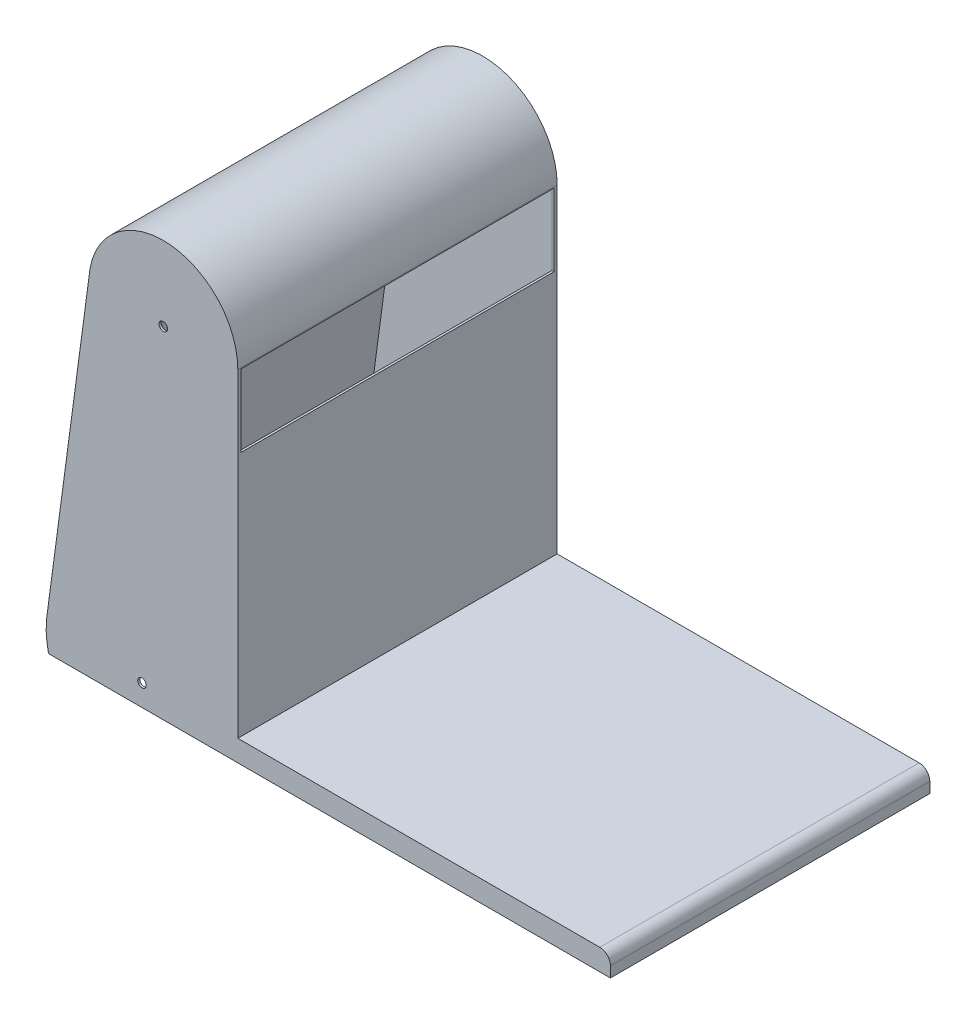
ISO-10303-21;
HEADER;
FILE_DESCRIPTION(('STEP AP214'),'2;1');
FILE_NAME('part.step','',(''),(''),'','','');
FILE_SCHEMA(('AUTOMOTIVE_DESIGN { 1 0 10303 214 1 1 1 1 }'));
ENDSEC;
DATA;
#1=APPLICATION_CONTEXT('core data for automotive mechanical design processes');
#2=APPLICATION_PROTOCOL_DEFINITION('international standard','automotive_design',2000,#1);
#3=PRODUCT_CONTEXT('',#1,'mechanical');
#4=PRODUCT('Part','Part','',(#3));
#5=PRODUCT_RELATED_PRODUCT_CATEGORY('part','',(#4));
#6=PRODUCT_DEFINITION_FORMATION('','',#4);
#7=PRODUCT_DEFINITION_CONTEXT('part definition',#1,'design');
#8=PRODUCT_DEFINITION('design','',#6,#7);
#9=PRODUCT_DEFINITION_SHAPE('','',#8);
#10=(LENGTH_UNIT() NAMED_UNIT(*) SI_UNIT(.MILLI.,.METRE.));
#11=(NAMED_UNIT(*) PLANE_ANGLE_UNIT() SI_UNIT($,.RADIAN.));
#12=(NAMED_UNIT(*) SI_UNIT($,.STERADIAN.) SOLID_ANGLE_UNIT());
#13=UNCERTAINTY_MEASURE_WITH_UNIT(LENGTH_MEASURE(1.E-05),#10,'distance_accuracy_value','');
#14=(GEOMETRIC_REPRESENTATION_CONTEXT(3) GLOBAL_UNCERTAINTY_ASSIGNED_CONTEXT((#13)) GLOBAL_UNIT_ASSIGNED_CONTEXT((#10,
#11,#12)) REPRESENTATION_CONTEXT('',''));
#15=CARTESIAN_POINT('',(0.,0.,0.));
#16=DIRECTION('',(0.,0.,1.));
#17=DIRECTION('',(1.,0.,0.));
#18=AXIS2_PLACEMENT_3D('',#15,#16,#17);
#19=CARTESIAN_POINT('',(20.,300.000000000011,-298.));
#20=DIRECTION('',(0.,0.,1.));
#21=DIRECTION('',(1.,0.,0.));
#22=AXIS2_PLACEMENT_3D('',#19,#20,#21);
#23=PLANE('',#22);
#24=CARTESIAN_POINT('',(0.,0.,-298.));
#25=DIRECTION('',(0.,0.,1.));
#26=DIRECTION('',(1.,0.,0.));
#27=AXIS2_PLACEMENT_3D('',#24,#25,#26);
#28=CIRCLE('',#27,88.0227243386615);
#29=CARTESIAN_POINT('',(88.,-2.,-298.));
#30=VERTEX_POINT('',#29);
#31=CARTESIAN_POINT('',(85.7204759669474,-20.,-298.));
#32=VERTEX_POINT('',#31);
#33=EDGE_CURVE('E256',#30,#32,#28,.F.);
#34=ORIENTED_EDGE('',*,*,#33,.F.);
#35=DIRECTION('',(0.,1.,0.));
#36=VECTOR('',#35,1.);
#37=CARTESIAN_POINT('',(88.,300.000000000011,-298.));
#38=LINE('',#37,#36);
#39=CARTESIAN_POINT('',(88.,300.,-298.));
#40=VERTEX_POINT('',#39);
#41=EDGE_CURVE('E305',#30,#40,#38,.T.);
#42=ORIENTED_EDGE('',*,*,#41,.T.);
#43=CARTESIAN_POINT('',(20.,300.000000000011,-298.));
#44=DIRECTION('',(0.,0.,1.));
#45=DIRECTION('',(1.,0.,0.));
#46=AXIS2_PLACEMENT_3D('',#43,#44,#45);
#47=CIRCLE('',#46,68.);
#48=CARTESIAN_POINT('',(-47.8537467098709,304.457472089961,-298.));
#49=VERTEX_POINT('',#48);
#50=EDGE_CURVE('E295',#40,#49,#47,.T.);
#51=ORIENTED_EDGE('',*,*,#50,.T.);
#52=DIRECTION('',(-0.132597658083784,-0.991169945605039,0.));
#53=VECTOR('',#52,1.);
#54=CARTESIAN_POINT('',(-47.2465640616155,308.996173611095,-298.));
#55=LINE('',#54,#53);
#56=CARTESIAN_POINT('',(-87.8094642321026,5.78774492104662,-298.));
#57=VERTEX_POINT('',#56);
#58=EDGE_CURVE('E299',#49,#57,#55,.T.);
#59=ORIENTED_EDGE('',*,*,#58,.T.);
#60=CARTESIAN_POINT('',(0.,0.,-298.));
#61=DIRECTION('',(0.,0.,1.));
#62=DIRECTION('',(1.,0.,0.));
#63=AXIS2_PLACEMENT_3D('',#60,#61,#62);
#64=CIRCLE('',#63,88.);
#65=CARTESIAN_POINT('',(-85.6971411425142,-20.,-298.));
#66=VERTEX_POINT('',#65);
#67=EDGE_CURVE('E338',#57,#66,#64,.T.);
#68=ORIENTED_EDGE('',*,*,#67,.T.);
#69=DIRECTION('',(1.,0.,0.));
#70=VECTOR('',#69,1.);
#71=CARTESIAN_POINT('',(20.,-20.,-298.));
#72=LINE('',#71,#70);
#73=EDGE_CURVE('E337',#66,#32,#72,.T.);
#74=ORIENTED_EDGE('',*,*,#73,.T.);
#75=EDGE_LOOP('',(#34,#42,#51,#59,#68,#74));
#76=FACE_BOUND('',#75,.T.);
#77=CARTESIAN_POINT('',(0.,0.,-298.));
#78=DIRECTION('',(0.,0.,1.));
#79=DIRECTION('',(1.,0.,0.));
#80=AXIS2_PLACEMENT_3D('',#77,#78,#79);
#81=CIRCLE('',#80,4.);
#82=CARTESIAN_POINT('',(4.,0.,-298.));
#83=VERTEX_POINT('',#82);
#84=EDGE_CURVE('E281',#83,#83,#81,.T.);
#85=ORIENTED_EDGE('',*,*,#84,.F.);
#86=EDGE_LOOP('',(#85));
#87=FACE_BOUND('',#86,.T.);
#88=CARTESIAN_POINT('',(20.,300.000000000011,-298.));
#89=DIRECTION('',(0.,0.,1.));
#90=DIRECTION('',(1.,0.,0.));
#91=AXIS2_PLACEMENT_3D('',#88,#89,#90);
#92=CIRCLE('',#91,4.);
#93=CARTESIAN_POINT('',(24.,300.000000000011,-298.));
#94=VERTEX_POINT('',#93);
#95=EDGE_CURVE('E276',#94,#94,#92,.T.);
#96=ORIENTED_EDGE('',*,*,#95,.F.);
#97=EDGE_LOOP('',(#96));
#98=FACE_BOUND('',#97,.T.);
#99=ADVANCED_FACE('F40',(#76,#87,#98),#23,.T.);
#100=CARTESIAN_POINT('',(20.,300.000000000011,-2.));
#101=DIRECTION('',(0.,0.,1.));
#102=DIRECTION('',(1.,0.,0.));
#103=AXIS2_PLACEMENT_3D('',#100,#101,#102);
#104=PLANE('',#103);
#105=CARTESIAN_POINT('',(20.,300.000000000011,-2.));
#106=DIRECTION('',(0.,0.,1.));
#107=DIRECTION('',(1.,0.,0.));
#108=AXIS2_PLACEMENT_3D('',#105,#106,#107);
#109=CIRCLE('',#108,4.);
#110=CARTESIAN_POINT('',(24.,300.000000000011,-2.));
#111=VERTEX_POINT('',#110);
#112=EDGE_CURVE('E264',#111,#111,#109,.T.);
#113=ORIENTED_EDGE('',*,*,#112,.T.);
#114=EDGE_LOOP('',(#113));
#115=FACE_BOUND('',#114,.T.);
#116=CARTESIAN_POINT('',(0.,0.,-2.));
#117=DIRECTION('',(0.,0.,1.));
#118=DIRECTION('',(1.,0.,0.));
#119=AXIS2_PLACEMENT_3D('',#116,#117,#118);
#120=CIRCLE('',#119,4.);
#121=CARTESIAN_POINT('',(4.,0.,-2.));
#122=VERTEX_POINT('',#121);
#123=EDGE_CURVE('E280',#122,#122,#120,.T.);
#124=ORIENTED_EDGE('',*,*,#123,.T.);
#125=EDGE_LOOP('',(#124));
#126=FACE_BOUND('',#125,.T.);
#127=DIRECTION('',(0.,1.,0.));
#128=VECTOR('',#127,1.);
#129=CARTESIAN_POINT('',(88.,300.000000000011,-2.));
#130=LINE('',#129,#128);
#131=CARTESIAN_POINT('',(88.,-2.,-2.));
#132=VERTEX_POINT('',#131);
#133=CARTESIAN_POINT('',(88.,300.,-2.));
#134=VERTEX_POINT('',#133);
#135=EDGE_CURVE('E300',#132,#134,#130,.T.);
#136=ORIENTED_EDGE('',*,*,#135,.F.);
#137=CARTESIAN_POINT('',(0.,0.,-2.));
#138=DIRECTION('',(0.,0.,1.));
#139=DIRECTION('',(1.,0.,0.));
#140=AXIS2_PLACEMENT_3D('',#137,#138,#139);
#141=CIRCLE('',#140,88.0227243386615);
#142=CARTESIAN_POINT('',(85.7204759669474,-20.,-2.));
#143=VERTEX_POINT('',#142);
#144=EDGE_CURVE('E11',#132,#143,#141,.F.);
#145=ORIENTED_EDGE('',*,*,#144,.T.);
#146=DIRECTION('',(1.,0.,0.));
#147=VECTOR('',#146,1.);
#148=CARTESIAN_POINT('',(20.,-20.,-2.));
#149=LINE('',#148,#147);
#150=CARTESIAN_POINT('',(-85.6971411425142,-20.,-2.));
#151=VERTEX_POINT('',#150);
#152=EDGE_CURVE('E352',#151,#143,#149,.T.);
#153=ORIENTED_EDGE('',*,*,#152,.F.);
#154=CARTESIAN_POINT('',(0.,0.,-2.));
#155=DIRECTION('',(0.,0.,1.));
#156=DIRECTION('',(1.,0.,0.));
#157=AXIS2_PLACEMENT_3D('',#154,#155,#156);
#158=CIRCLE('',#157,88.);
#159=CARTESIAN_POINT('',(-87.8094642321026,5.78774492104662,-2.));
#160=VERTEX_POINT('',#159);
#161=EDGE_CURVE('E358',#160,#151,#158,.T.);
#162=ORIENTED_EDGE('',*,*,#161,.F.);
#163=DIRECTION('',(-0.132597658083784,-0.991169945605039,0.));
#164=VECTOR('',#163,1.);
#165=CARTESIAN_POINT('',(-47.2465640616155,308.996173611095,-2.));
#166=LINE('',#165,#164);
#167=CARTESIAN_POINT('',(-47.8537467098709,304.457472089961,-2.));
#168=VERTEX_POINT('',#167);
#169=EDGE_CURVE('E289',#168,#160,#166,.T.);
#170=ORIENTED_EDGE('',*,*,#169,.F.);
#171=CARTESIAN_POINT('',(20.,300.000000000011,-2.));
#172=DIRECTION('',(0.,0.,1.));
#173=DIRECTION('',(1.,0.,0.));
#174=AXIS2_PLACEMENT_3D('',#171,#172,#173);
#175=CIRCLE('',#174,68.);
#176=EDGE_CURVE('E285',#134,#168,#175,.T.);
#177=ORIENTED_EDGE('',*,*,#176,.F.);
#178=EDGE_LOOP('',(#136,#145,#153,#162,#170,#177));
#179=FACE_BOUND('',#178,.T.);
#180=ADVANCED_FACE('F514',(#115,#126,#179),#104,.F.);
#181=CARTESIAN_POINT('',(400.,-20.,-300.));
#182=DIRECTION('',(0.,-1.,0.));
#183=DIRECTION('',(0.,0.,-1.));
#184=AXIS2_PLACEMENT_3D('',#181,#182,#183);
#185=PLANE('',#184);
#186=ORIENTED_EDGE('',*,*,#152,.T.);
#187=DIRECTION('',(0.,0.,1.));
#188=VECTOR('',#187,1.);
#189=CARTESIAN_POINT('',(85.7204759669474,-20.,-320.452733948044));
#190=LINE('',#189,#188);
#191=EDGE_CURVE('E243',#32,#143,#190,.T.);
#192=ORIENTED_EDGE('',*,*,#191,.F.);
#193=ORIENTED_EDGE('',*,*,#73,.F.);
#194=DIRECTION('',(0.,0.,1.));
#195=VECTOR('',#194,1.);
#196=CARTESIAN_POINT('',(-85.6971411425142,-20.,-298.));
#197=LINE('',#196,#195);
#198=EDGE_CURVE('E365',#66,#151,#197,.T.);
#199=ORIENTED_EDGE('',*,*,#198,.T.);
#200=EDGE_LOOP('',(#186,#192,#193,#199));
#201=FACE_BOUND('',#200,.T.);
#202=CARTESIAN_POINT('',(87.7496438739212,-20.,-298.));
#203=VERTEX_POINT('',#202);
#204=CARTESIAN_POINT('',(438.,-20.,-298.));
#205=VERTEX_POINT('',#204);
#206=EDGE_CURVE('E342',#203,#205,#72,.T.);
#207=ORIENTED_EDGE('',*,*,#206,.F.);
#208=DIRECTION('',(0.,0.,1.));
#209=VECTOR('',#208,1.);
#210=CARTESIAN_POINT('',(87.7496438739212,-20.,-320.452733948044));
#211=LINE('',#210,#209);
#212=CARTESIAN_POINT('',(87.7496438739212,-20.,-2.));
#213=VERTEX_POINT('',#212);
#214=EDGE_CURVE('E244',#203,#213,#211,.T.);
#215=ORIENTED_EDGE('',*,*,#214,.T.);
#216=CARTESIAN_POINT('',(438.,-20.,-2.));
#217=VERTEX_POINT('',#216);
#218=EDGE_CURVE('E362',#213,#217,#149,.T.);
#219=ORIENTED_EDGE('',*,*,#218,.T.);
#220=DIRECTION('',(0.,0.,1.));
#221=VECTOR('',#220,1.);
#222=CARTESIAN_POINT('',(438.,-20.,-300.));
#223=LINE('',#222,#221);
#224=EDGE_CURVE('E313',#205,#217,#223,.T.);
#225=ORIENTED_EDGE('',*,*,#224,.F.);
#226=EDGE_LOOP('',(#207,#215,#219,#225));
#227=FACE_BOUND('',#226,.T.);
#228=DIRECTION('',(1.,0.,0.));
#229=VECTOR('',#228,1.);
#230=CARTESIAN_POINT('',(0.,-20.,-300.));
#231=LINE('',#230,#229);
#232=CARTESIAN_POINT('',(-87.7496438739212,-20.,-300.));
#233=VERTEX_POINT('',#232);
#234=CARTESIAN_POINT('',(440.,-20.,-300.));
#235=VERTEX_POINT('',#234);
#236=EDGE_CURVE('E391',#233,#235,#231,.T.);
#237=ORIENTED_EDGE('',*,*,#236,.T.);
#238=DIRECTION('',(0.,0.,1.));
#239=VECTOR('',#238,1.);
#240=CARTESIAN_POINT('',(440.,-20.,-300.));
#241=LINE('',#240,#239);
#242=CARTESIAN_POINT('',(440.,-20.,0.));
#243=VERTEX_POINT('',#242);
#244=EDGE_CURVE('E438',#235,#243,#241,.T.);
#245=ORIENTED_EDGE('',*,*,#244,.T.);
#246=DIRECTION('',(1.,0.,0.));
#247=VECTOR('',#246,1.);
#248=CARTESIAN_POINT('',(400.,-20.,0.));
#249=LINE('',#248,#247);
#250=CARTESIAN_POINT('',(-87.7496438739212,-20.,0.));
#251=VERTEX_POINT('',#250);
#252=EDGE_CURVE('E417',#251,#243,#249,.T.);
#253=ORIENTED_EDGE('',*,*,#252,.F.);
#254=DIRECTION('',(0.,0.,1.));
#255=VECTOR('',#254,1.);
#256=CARTESIAN_POINT('',(-87.7496438739212,-20.,-300.));
#257=LINE('',#256,#255);
#258=EDGE_CURVE('E442',#233,#251,#257,.T.);
#259=ORIENTED_EDGE('',*,*,#258,.F.);
#260=EDGE_LOOP('',(#237,#245,#253,#259));
#261=FACE_BOUND('',#260,.T.);
#262=ADVANCED_FACE('F491',(#201,#227,#261),#185,.T.);
#263=CARTESIAN_POINT('',(20.,300.000000000011,-300.));
#264=DIRECTION('',(0.,0.,1.));
#265=DIRECTION('',(1.,0.,0.));
#266=AXIS2_PLACEMENT_3D('',#263,#264,#265);
#267=CYLINDRICAL_SURFACE('',#266,70.);
#268=CARTESIAN_POINT('',(20.,300.000000000011,0.));
#269=DIRECTION('',(0.,0.,1.));
#270=DIRECTION('',(1.,0.,0.));
#271=AXIS2_PLACEMENT_3D('',#268,#269,#270);
#272=CIRCLE('',#271,70.);
#273=CARTESIAN_POINT('',(90.,300.,0.));
#274=VERTEX_POINT('',#273);
#275=CARTESIAN_POINT('',(-49.8449610499633,304.656330736664,0.));
#276=VERTEX_POINT('',#275);
#277=EDGE_CURVE('E333',#274,#276,#272,.T.);
#278=ORIENTED_EDGE('',*,*,#277,.F.);
#279=DIRECTION('',(0.,0.,1.));
#280=VECTOR('',#279,1.);
#281=CARTESIAN_POINT('',(90.,300.,-300.));
#282=LINE('',#281,#280);
#283=CARTESIAN_POINT('',(90.,300.,-300.));
#284=VERTEX_POINT('',#283);
#285=EDGE_CURVE('E430',#284,#274,#282,.T.);
#286=ORIENTED_EDGE('',*,*,#285,.F.);
#287=CARTESIAN_POINT('',(20.,300.000000000011,-300.));
#288=DIRECTION('',(0.,0.,1.));
#289=DIRECTION('',(1.,0.,0.));
#290=AXIS2_PLACEMENT_3D('',#287,#288,#289);
#291=CIRCLE('',#290,70.);
#292=CARTESIAN_POINT('',(-49.8449610499633,304.656330736664,-300.));
#293=VERTEX_POINT('',#292);
#294=EDGE_CURVE('E378',#284,#293,#291,.T.);
#295=ORIENTED_EDGE('',*,*,#294,.T.);
#296=DIRECTION('',(0.,0.,1.));
#297=VECTOR('',#296,1.);
#298=CARTESIAN_POINT('',(-49.8449610499633,304.656330736664,-300.));
#299=LINE('',#298,#297);
#300=EDGE_CURVE('E405',#293,#276,#299,.T.);
#301=ORIENTED_EDGE('',*,*,#300,.T.);
#302=EDGE_LOOP('',(#278,#286,#295,#301));
#303=FACE_BOUND('',#302,.T.);
#304=ADVANCED_FACE('F585',(#303),#267,.T.);
#305=CARTESIAN_POINT('',(90.,0.,-300.));
#306=DIRECTION('',(1.,0.,0.));
#307=DIRECTION('',(0.,0.,-1.));
#308=AXIS2_PLACEMENT_3D('',#305,#306,#307);
#309=PLANE('',#308);
#310=DIRECTION('',(0.,1.,0.));
#311=VECTOR('',#310,1.);
#312=CARTESIAN_POINT('',(90.,0.,-297.));
#313=LINE('',#312,#311);
#314=CARTESIAN_POINT('',(90.,231.,-297.));
#315=VERTEX_POINT('',#314);
#316=CARTESIAN_POINT('',(90.,299.,-297.));
#317=VERTEX_POINT('',#316);
#318=EDGE_CURVE('E240',#315,#317,#313,.T.);
#319=ORIENTED_EDGE('',*,*,#318,.F.);
#320=DIRECTION('',(0.,0.,-1.));
#321=VECTOR('',#320,1.);
#322=CARTESIAN_POINT('',(90.,231.,-300.));
#323=LINE('',#322,#321);
#324=CARTESIAN_POINT('',(90.,231.,-3.));
#325=VERTEX_POINT('',#324);
#326=EDGE_CURVE('E227',#325,#315,#323,.T.);
#327=ORIENTED_EDGE('',*,*,#326,.F.);
#328=DIRECTION('',(0.,-1.,0.));
#329=VECTOR('',#328,1.);
#330=CARTESIAN_POINT('',(90.,0.,-3.));
#331=LINE('',#330,#329);
#332=CARTESIAN_POINT('',(90.,299.,-3.00000000000001));
#333=VERTEX_POINT('',#332);
#334=EDGE_CURVE('E202',#333,#325,#331,.T.);
#335=ORIENTED_EDGE('',*,*,#334,.F.);
#336=DIRECTION('',(0.,0.,1.));
#337=VECTOR('',#336,1.);
#338=CARTESIAN_POINT('',(90.,299.,-300.));
#339=LINE('',#338,#337);
#340=EDGE_CURVE('E237',#317,#333,#339,.T.);
#341=ORIENTED_EDGE('',*,*,#340,.F.);
#342=EDGE_LOOP('',(#319,#327,#335,#341));
#343=FACE_BOUND('',#342,.T.);
#344=DIRECTION('',(0.,1.,0.));
#345=VECTOR('',#344,1.);
#346=CARTESIAN_POINT('',(90.,0.,0.));
#347=LINE('',#346,#345);
#348=CARTESIAN_POINT('',(90.,0.,0.));
#349=VERTEX_POINT('',#348);
#350=EDGE_CURVE('E383',#349,#274,#347,.T.);
#351=ORIENTED_EDGE('',*,*,#350,.F.);
#352=DIRECTION('',(0.,0.,1.));
#353=VECTOR('',#352,1.);
#354=CARTESIAN_POINT('',(90.,0.,-300.));
#355=LINE('',#354,#353);
#356=CARTESIAN_POINT('',(90.,0.,-300.));
#357=VERTEX_POINT('',#356);
#358=EDGE_CURVE('E434',#357,#349,#355,.T.);
#359=ORIENTED_EDGE('',*,*,#358,.F.);
#360=DIRECTION('',(0.,1.,0.));
#361=VECTOR('',#360,1.);
#362=CARTESIAN_POINT('',(90.,0.,-300.));
#363=LINE('',#362,#361);
#364=EDGE_CURVE('E401',#357,#284,#363,.T.);
#365=ORIENTED_EDGE('',*,*,#364,.T.);
#366=ORIENTED_EDGE('',*,*,#285,.T.);
#367=EDGE_LOOP('',(#351,#359,#365,#366));
#368=FACE_BOUND('',#367,.T.);
#369=ADVANCED_FACE('F591',(#343,#368),#309,.T.);
#370=CARTESIAN_POINT('',(440.,0.,-300.));
#371=DIRECTION('',(0.,1.,0.));
#372=DIRECTION('',(0.,0.,1.));
#373=AXIS2_PLACEMENT_3D('',#370,#371,#372);
#374=PLANE('',#373);
#375=DIRECTION('',(-1.,0.,0.));
#376=VECTOR('',#375,1.);
#377=CARTESIAN_POINT('',(440.,0.,0.));
#378=LINE('',#377,#376);
#379=CARTESIAN_POINT('',(430.,0.,0.));
#380=VERTEX_POINT('',#379);
#381=EDGE_CURVE('E424',#380,#349,#378,.T.);
#382=ORIENTED_EDGE('',*,*,#381,.F.);
#383=DIRECTION('',(0.,0.,1.));
#384=VECTOR('',#383,1.);
#385=CARTESIAN_POINT('',(430.,0.,-300.));
#386=LINE('',#385,#384);
#387=CARTESIAN_POINT('',(430.,0.,-300.));
#388=VERTEX_POINT('',#387);
#389=EDGE_CURVE('E457',#380,#388,#386,.F.);
#390=ORIENTED_EDGE('',*,*,#389,.T.);
#391=DIRECTION('',(-1.,0.,0.));
#392=VECTOR('',#391,1.);
#393=CARTESIAN_POINT('',(440.,0.,-300.));
#394=LINE('',#393,#392);
#395=EDGE_CURVE('E398',#388,#357,#394,.T.);
#396=ORIENTED_EDGE('',*,*,#395,.T.);
#397=ORIENTED_EDGE('',*,*,#358,.T.);
#398=EDGE_LOOP('',(#382,#390,#396,#397));
#399=FACE_BOUND('',#398,.T.);
#400=ADVANCED_FACE('F628',(#399),#374,.T.);
#401=CARTESIAN_POINT('',(440.,-20.,-300.));
#402=DIRECTION('',(1.,0.,0.));
#403=DIRECTION('',(0.,0.,-1.));
#404=AXIS2_PLACEMENT_3D('',#401,#402,#403);
#405=PLANE('',#404);
#406=DIRECTION('',(0.,1.,0.));
#407=VECTOR('',#406,1.);
#408=CARTESIAN_POINT('',(440.,-20.,-300.));
#409=LINE('',#408,#407);
#410=CARTESIAN_POINT('',(440.,-10.,-300.));
#411=VERTEX_POINT('',#410);
#412=EDGE_CURVE('E394',#235,#411,#409,.T.);
#413=ORIENTED_EDGE('',*,*,#412,.T.);
#414=DIRECTION('',(0.,0.,1.));
#415=VECTOR('',#414,1.);
#416=CARTESIAN_POINT('',(440.,-10.,-300.));
#417=LINE('',#416,#415);
#418=CARTESIAN_POINT('',(440.,-10.,0.));
#419=VERTEX_POINT('',#418);
#420=EDGE_CURVE('E433',#411,#419,#417,.T.);
#421=ORIENTED_EDGE('',*,*,#420,.T.);
#422=DIRECTION('',(0.,1.,0.));
#423=VECTOR('',#422,1.);
#424=CARTESIAN_POINT('',(440.,-20.,0.));
#425=LINE('',#424,#423);
#426=EDGE_CURVE('E420',#243,#419,#425,.T.);
#427=ORIENTED_EDGE('',*,*,#426,.F.);
#428=ORIENTED_EDGE('',*,*,#244,.F.);
#429=EDGE_LOOP('',(#413,#421,#427,#428));
#430=FACE_BOUND('',#429,.T.);
#431=ADVANCED_FACE('F595',(#430),#405,.T.);
#432=CARTESIAN_POINT('',(0.,0.,-300.));
#433=DIRECTION('',(0.,0.,1.));
#434=DIRECTION('',(1.,0.,0.));
#435=AXIS2_PLACEMENT_3D('',#432,#433,#434);
#436=CYLINDRICAL_SURFACE('',#435,90.);
#437=CARTESIAN_POINT('',(0.,0.,0.));
#438=DIRECTION('',(0.,0.,1.));
#439=DIRECTION('',(1.,0.,0.));
#440=AXIS2_PLACEMENT_3D('',#437,#438,#439);
#441=CIRCLE('',#440,90.);
#442=CARTESIAN_POINT('',(-89.8006642070948,5.98671094713966,0.));
#443=VERTEX_POINT('',#442);
#444=EDGE_CURVE('E413',#443,#251,#441,.T.);
#445=ORIENTED_EDGE('',*,*,#444,.F.);
#446=DIRECTION('',(0.,0.,1.));
#447=VECTOR('',#446,1.);
#448=CARTESIAN_POINT('',(-89.8006642070948,5.98671094713966,-300.));
#449=LINE('',#448,#447);
#450=CARTESIAN_POINT('',(-89.8006642070948,5.98671094713966,-300.));
#451=VERTEX_POINT('',#450);
#452=EDGE_CURVE('E446',#451,#443,#449,.T.);
#453=ORIENTED_EDGE('',*,*,#452,.F.);
#454=CARTESIAN_POINT('',(0.,0.,-300.));
#455=DIRECTION('',(0.,0.,1.));
#456=DIRECTION('',(1.,0.,0.));
#457=AXIS2_PLACEMENT_3D('',#454,#455,#456);
#458=CIRCLE('',#457,90.);
#459=EDGE_CURVE('E387',#451,#233,#458,.T.);
#460=ORIENTED_EDGE('',*,*,#459,.T.);
#461=ORIENTED_EDGE('',*,*,#258,.T.);
#462=EDGE_LOOP('',(#445,#453,#460,#461));
#463=FACE_BOUND('',#462,.T.);
#464=ADVANCED_FACE('F597',(#463),#436,.T.);
#465=CARTESIAN_POINT('',(-49.8449610499633,304.656330736664,-300.));
#466=DIRECTION('',(-0.991169945605039,0.132597658083784,0.));
#467=DIRECTION('',(-0.132597658083784,-0.991169945605039,0.));
#468=AXIS2_PLACEMENT_3D('',#465,#466,#467);
#469=PLANE('',#468);
#470=DIRECTION('',(-0.132597658083784,-0.991169945605039,0.));
#471=VECTOR('',#470,1.);
#472=CARTESIAN_POINT('',(-49.8449610499633,304.656330736664,0.));
#473=LINE('',#472,#471);
#474=EDGE_CURVE('E409',#276,#443,#473,.T.);
#475=ORIENTED_EDGE('',*,*,#474,.F.);
#476=ORIENTED_EDGE('',*,*,#300,.F.);
#477=DIRECTION('',(-0.132597658083784,-0.991169945605039,0.));
#478=VECTOR('',#477,1.);
#479=CARTESIAN_POINT('',(-49.8449610499633,304.656330736664,-300.));
#480=LINE('',#479,#478);
#481=EDGE_CURVE('E382',#293,#451,#480,.T.);
#482=ORIENTED_EDGE('',*,*,#481,.T.);
#483=ORIENTED_EDGE('',*,*,#452,.T.);
#484=EDGE_LOOP('',(#475,#476,#482,#483));
#485=FACE_BOUND('',#484,.T.);
#486=ADVANCED_FACE('F600',(#485),#469,.T.);
#487=CARTESIAN_POINT('',(20.,300.000000000011,-300.));
#488=DIRECTION('',(0.,0.,1.));
#489=DIRECTION('',(1.,0.,0.));
#490=AXIS2_PLACEMENT_3D('',#487,#488,#489);
#491=PLANE('',#490);
#492=ORIENTED_EDGE('',*,*,#412,.F.);
#493=ORIENTED_EDGE('',*,*,#236,.F.);
#494=ORIENTED_EDGE('',*,*,#459,.F.);
#495=ORIENTED_EDGE('',*,*,#481,.F.);
#496=ORIENTED_EDGE('',*,*,#294,.F.);
#497=ORIENTED_EDGE('',*,*,#364,.F.);
#498=ORIENTED_EDGE('',*,*,#395,.F.);
#499=CARTESIAN_POINT('',(430.,-10.,-300.));
#500=DIRECTION('',(0.,0.,1.));
#501=DIRECTION('',(1.,0.,0.));
#502=AXIS2_PLACEMENT_3D('',#499,#500,#501);
#503=CIRCLE('',#502,10.);
#504=EDGE_CURVE('E460',#388,#411,#503,.F.);
#505=ORIENTED_EDGE('',*,*,#504,.T.);
#506=EDGE_LOOP('',(#492,#493,#494,#495,#496,#497,#498,#505));
#507=FACE_BOUND('',#506,.T.);
#508=CARTESIAN_POINT('',(20.,300.000000000011,-300.));
#509=DIRECTION('',(0.,0.,1.));
#510=DIRECTION('',(1.,0.,0.));
#511=AXIS2_PLACEMENT_3D('',#508,#509,#510);
#512=CIRCLE('',#511,4.);
#513=CARTESIAN_POINT('',(24.,300.000000000011,-300.));
#514=VERTEX_POINT('',#513);
#515=EDGE_CURVE('E269',#514,#514,#512,.T.);
#516=ORIENTED_EDGE('',*,*,#515,.T.);
#517=EDGE_LOOP('',(#516));
#518=FACE_BOUND('',#517,.T.);
#519=CARTESIAN_POINT('',(0.,0.,-300.));
#520=DIRECTION('',(0.,0.,1.));
#521=DIRECTION('',(1.,0.,0.));
#522=AXIS2_PLACEMENT_3D('',#519,#520,#521);
#523=CIRCLE('',#522,4.);
#524=CARTESIAN_POINT('',(4.,0.,-300.));
#525=VERTEX_POINT('',#524);
#526=EDGE_CURVE('E260',#525,#525,#523,.T.);
#527=ORIENTED_EDGE('',*,*,#526,.T.);
#528=EDGE_LOOP('',(#527));
#529=FACE_BOUND('',#528,.T.);
#530=ADVANCED_FACE('F603',(#507,#518,#529),#491,.F.);
#531=CARTESIAN_POINT('',(20.,300.000000000011,0.));
#532=DIRECTION('',(0.,0.,1.));
#533=DIRECTION('',(1.,0.,0.));
#534=AXIS2_PLACEMENT_3D('',#531,#532,#533);
#535=PLANE('',#534);
#536=ORIENTED_EDGE('',*,*,#252,.T.);
#537=ORIENTED_EDGE('',*,*,#426,.T.);
#538=CARTESIAN_POINT('',(430.,-10.,0.));
#539=DIRECTION('',(0.,0.,1.));
#540=DIRECTION('',(1.,0.,0.));
#541=AXIS2_PLACEMENT_3D('',#538,#539,#540);
#542=CIRCLE('',#541,10.);
#543=EDGE_CURVE('E454',#419,#380,#542,.T.);
#544=ORIENTED_EDGE('',*,*,#543,.T.);
#545=ORIENTED_EDGE('',*,*,#381,.T.);
#546=ORIENTED_EDGE('',*,*,#350,.T.);
#547=ORIENTED_EDGE('',*,*,#277,.T.);
#548=ORIENTED_EDGE('',*,*,#474,.T.);
#549=ORIENTED_EDGE('',*,*,#444,.T.);
#550=EDGE_LOOP('',(#536,#537,#544,#545,#546,#547,#548,#549));
#551=FACE_BOUND('',#550,.T.);
#552=CARTESIAN_POINT('',(0.,0.,0.));
#553=DIRECTION('',(0.,0.,1.));
#554=DIRECTION('',(1.,0.,0.));
#555=AXIS2_PLACEMENT_3D('',#552,#553,#554);
#556=CIRCLE('',#555,4.);
#557=CARTESIAN_POINT('',(4.,0.,0.));
#558=VERTEX_POINT('',#557);
#559=EDGE_CURVE('E265',#558,#558,#556,.T.);
#560=ORIENTED_EDGE('',*,*,#559,.F.);
#561=EDGE_LOOP('',(#560));
#562=FACE_BOUND('',#561,.T.);
#563=CARTESIAN_POINT('',(20.,300.000000000011,0.));
#564=DIRECTION('',(0.,0.,1.));
#565=DIRECTION('',(1.,0.,0.));
#566=AXIS2_PLACEMENT_3D('',#563,#564,#565);
#567=CIRCLE('',#566,4.);
#568=CARTESIAN_POINT('',(24.,300.000000000011,0.));
#569=VERTEX_POINT('',#568);
#570=EDGE_CURVE('E259',#569,#569,#567,.T.);
#571=ORIENTED_EDGE('',*,*,#570,.F.);
#572=EDGE_LOOP('',(#571));
#573=FACE_BOUND('',#572,.T.);
#574=ADVANCED_FACE('F608',(#551,#562,#573),#535,.T.);
#575=CARTESIAN_POINT('',(430.,-10.,-300.));
#576=DIRECTION('',(0.,0.,1.));
#577=DIRECTION('',(1.,0.,0.));
#578=AXIS2_PLACEMENT_3D('',#575,#576,#577);
#579=CYLINDRICAL_SURFACE('',#578,10.);
#580=ORIENTED_EDGE('',*,*,#504,.F.);
#581=ORIENTED_EDGE('',*,*,#389,.F.);
#582=ORIENTED_EDGE('',*,*,#543,.F.);
#583=ORIENTED_EDGE('',*,*,#420,.F.);
#584=EDGE_LOOP('',(#580,#581,#582,#583));
#585=FACE_BOUND('',#584,.T.);
#586=ADVANCED_FACE('F42',(#585),#579,.T.);
#587=CARTESIAN_POINT('',(20.,300.000000000011,-300.));
#588=DIRECTION('',(0.,0.,1.));
#589=DIRECTION('',(1.,0.,0.));
#590=AXIS2_PLACEMENT_3D('',#587,#588,#589);
#591=CYLINDRICAL_SURFACE('',#590,68.);
#592=ORIENTED_EDGE('',*,*,#176,.T.);
#593=DIRECTION('',(0.,0.,1.));
#594=VECTOR('',#593,1.);
#595=CARTESIAN_POINT('',(-47.8537467098709,304.457472089961,-298.));
#596=LINE('',#595,#594);
#597=EDGE_CURVE('E301',#49,#168,#596,.T.);
#598=ORIENTED_EDGE('',*,*,#597,.F.);
#599=ORIENTED_EDGE('',*,*,#50,.F.);
#600=DIRECTION('',(0.,0.,-1.));
#601=VECTOR('',#600,1.);
#602=CARTESIAN_POINT('',(88.,300.,-300.));
#603=LINE('',#602,#601);
#604=EDGE_CURVE('E290',#40,#134,#603,.F.);
#605=ORIENTED_EDGE('',*,*,#604,.T.);
#606=EDGE_LOOP('',(#592,#598,#599,#605));
#607=FACE_BOUND('',#606,.T.);
#608=ADVANCED_FACE('F547',(#607),#591,.F.);
#609=CARTESIAN_POINT('',(88.,0.,-300.));
#610=DIRECTION('',(1.,0.,0.));
#611=DIRECTION('',(0.,0.,-1.));
#612=AXIS2_PLACEMENT_3D('',#609,#610,#611);
#613=PLANE('',#612);
#614=DIRECTION('',(0.,0.,1.));
#615=VECTOR('',#614,1.);
#616=CARTESIAN_POINT('',(88.,231.,-7.00000000000001));
#617=LINE('',#616,#615);
#618=CARTESIAN_POINT('',(88.,231.,-297.));
#619=VERTEX_POINT('',#618);
#620=CARTESIAN_POINT('',(88.,231.,-3.00000000000001));
#621=VERTEX_POINT('',#620);
#622=EDGE_CURVE('E208',#619,#621,#617,.T.);
#623=ORIENTED_EDGE('',*,*,#622,.F.);
#624=DIRECTION('',(0.,-1.,0.));
#625=VECTOR('',#624,1.);
#626=CARTESIAN_POINT('',(88.,299.,-297.));
#627=LINE('',#626,#625);
#628=CARTESIAN_POINT('',(88.,299.,-297.));
#629=VERTEX_POINT('',#628);
#630=EDGE_CURVE('E64',#629,#619,#627,.T.);
#631=ORIENTED_EDGE('',*,*,#630,.F.);
#632=DIRECTION('',(0.,0.,-1.));
#633=VECTOR('',#632,1.);
#634=CARTESIAN_POINT('',(88.,299.,-293.));
#635=LINE('',#634,#633);
#636=CARTESIAN_POINT('',(88.,299.,-3.00000000000001));
#637=VERTEX_POINT('',#636);
#638=EDGE_CURVE('E217',#637,#629,#635,.T.);
#639=ORIENTED_EDGE('',*,*,#638,.F.);
#640=DIRECTION('',(0.,1.,0.));
#641=VECTOR('',#640,1.);
#642=CARTESIAN_POINT('',(88.,231.,-3.00000000000001));
#643=LINE('',#642,#641);
#644=EDGE_CURVE('E199',#621,#637,#643,.T.);
#645=ORIENTED_EDGE('',*,*,#644,.F.);
#646=EDGE_LOOP('',(#623,#631,#639,#645));
#647=FACE_BOUND('',#646,.T.);
#648=ORIENTED_EDGE('',*,*,#135,.T.);
#649=ORIENTED_EDGE('',*,*,#604,.F.);
#650=ORIENTED_EDGE('',*,*,#41,.F.);
#651=DIRECTION('',(0.,0.,1.));
#652=VECTOR('',#651,1.);
#653=CARTESIAN_POINT('',(88.,-2.,-300.));
#654=LINE('',#653,#652);
#655=EDGE_CURVE('E294',#30,#132,#654,.T.);
#656=ORIENTED_EDGE('',*,*,#655,.T.);
#657=EDGE_LOOP('',(#648,#649,#650,#656));
#658=FACE_BOUND('',#657,.T.);
#659=ADVANCED_FACE('F214',(#647,#658),#613,.F.);
#660=CARTESIAN_POINT('',(440.,-2.,-300.));
#661=DIRECTION('',(0.,1.,0.));
#662=DIRECTION('',(0.,0.,1.));
#663=AXIS2_PLACEMENT_3D('',#660,#661,#662);
#664=PLANE('',#663);
#665=DIRECTION('',(-1.,0.,0.));
#666=VECTOR('',#665,1.);
#667=CARTESIAN_POINT('',(20.,-2.,-2.));
#668=LINE('',#667,#666);
#669=CARTESIAN_POINT('',(430.,-2.,-2.));
#670=VERTEX_POINT('',#669);
#671=CARTESIAN_POINT('',(89.9777750336159,-2.,-2.));
#672=VERTEX_POINT('',#671);
#673=EDGE_CURVE('E309',#670,#672,#668,.T.);
#674=ORIENTED_EDGE('',*,*,#673,.T.);
#675=DIRECTION('',(0.,0.,1.));
#676=VECTOR('',#675,1.);
#677=CARTESIAN_POINT('',(89.9777750336159,-2.,-320.452733948044));
#678=LINE('',#677,#676);
#679=CARTESIAN_POINT('',(89.9777750336159,-2.,-298.));
#680=VERTEX_POINT('',#679);
#681=EDGE_CURVE('E247',#672,#680,#678,.F.);
#682=ORIENTED_EDGE('',*,*,#681,.T.);
#683=DIRECTION('',(-1.,0.,0.));
#684=VECTOR('',#683,1.);
#685=CARTESIAN_POINT('',(20.,-2.,-298.));
#686=LINE('',#685,#684);
#687=CARTESIAN_POINT('',(430.,-2.,-298.));
#688=VERTEX_POINT('',#687);
#689=EDGE_CURVE('E317',#688,#680,#686,.T.);
#690=ORIENTED_EDGE('',*,*,#689,.F.);
#691=DIRECTION('',(0.,0.,1.));
#692=VECTOR('',#691,1.);
#693=CARTESIAN_POINT('',(430.,-2.,-300.));
#694=LINE('',#693,#692);
#695=EDGE_CURVE('E322',#670,#688,#694,.F.);
#696=ORIENTED_EDGE('',*,*,#695,.F.);
#697=EDGE_LOOP('',(#674,#682,#690,#696));
#698=FACE_BOUND('',#697,.T.);
#699=ADVANCED_FACE('F479',(#698),#664,.F.);
#700=CARTESIAN_POINT('',(438.,-20.,-300.));
#701=DIRECTION('',(1.,0.,0.));
#702=DIRECTION('',(0.,0.,-1.));
#703=AXIS2_PLACEMENT_3D('',#700,#701,#702);
#704=PLANE('',#703);
#705=DIRECTION('',(0.,1.,0.));
#706=VECTOR('',#705,1.);
#707=CARTESIAN_POINT('',(438.,300.000000000011,-298.));
#708=LINE('',#707,#706);
#709=CARTESIAN_POINT('',(438.,-10.,-298.));
#710=VERTEX_POINT('',#709);
#711=EDGE_CURVE('E330',#205,#710,#708,.T.);
#712=ORIENTED_EDGE('',*,*,#711,.F.);
#713=ORIENTED_EDGE('',*,*,#224,.T.);
#714=DIRECTION('',(0.,1.,0.));
#715=VECTOR('',#714,1.);
#716=CARTESIAN_POINT('',(438.,300.000000000011,-2.));
#717=LINE('',#716,#715);
#718=CARTESIAN_POINT('',(438.,-10.,-2.));
#719=VERTEX_POINT('',#718);
#720=EDGE_CURVE('E321',#217,#719,#717,.T.);
#721=ORIENTED_EDGE('',*,*,#720,.T.);
#722=DIRECTION('',(0.,0.,-1.));
#723=VECTOR('',#722,1.);
#724=CARTESIAN_POINT('',(438.,-10.,-300.));
#725=LINE('',#724,#723);
#726=EDGE_CURVE('E293',#710,#719,#725,.F.);
#727=ORIENTED_EDGE('',*,*,#726,.F.);
#728=EDGE_LOOP('',(#712,#713,#721,#727));
#729=FACE_BOUND('',#728,.T.);
#730=ADVANCED_FACE('F487',(#729),#704,.F.);
#731=CARTESIAN_POINT('',(0.,0.,-300.));
#732=DIRECTION('',(0.,0.,1.));
#733=DIRECTION('',(1.,0.,0.));
#734=AXIS2_PLACEMENT_3D('',#731,#732,#733);
#735=CYLINDRICAL_SURFACE('',#734,88.);
#736=ORIENTED_EDGE('',*,*,#161,.T.);
#737=ORIENTED_EDGE('',*,*,#198,.F.);
#738=ORIENTED_EDGE('',*,*,#67,.F.);
#739=DIRECTION('',(0.,0.,1.));
#740=VECTOR('',#739,1.);
#741=CARTESIAN_POINT('',(-87.8094642321026,5.78774492104662,-298.));
#742=LINE('',#741,#740);
#743=EDGE_CURVE('E304',#57,#160,#742,.T.);
#744=ORIENTED_EDGE('',*,*,#743,.T.);
#745=EDGE_LOOP('',(#736,#737,#738,#744));
#746=FACE_BOUND('',#745,.T.);
#747=ADVANCED_FACE('F532',(#746),#735,.F.);
#748=CARTESIAN_POINT('',(-47.8626211587533,304.391135420497,-300.));
#749=DIRECTION('',(-0.991169945605039,0.132597658083784,0.));
#750=DIRECTION('',(-0.132597658083784,-0.991169945605039,0.));
#751=AXIS2_PLACEMENT_3D('',#748,#749,#750);
#752=PLANE('',#751);
#753=ORIENTED_EDGE('',*,*,#169,.T.);
#754=ORIENTED_EDGE('',*,*,#743,.F.);
#755=ORIENTED_EDGE('',*,*,#58,.F.);
#756=ORIENTED_EDGE('',*,*,#597,.T.);
#757=EDGE_LOOP('',(#753,#754,#755,#756));
#758=FACE_BOUND('',#757,.T.);
#759=ADVANCED_FACE('F527',(#758),#752,.F.);
#760=CARTESIAN_POINT('',(0.,0.,-298.));
#761=DIRECTION('',(0.,0.,1.));
#762=DIRECTION('',(1.,0.,0.));
#763=AXIS2_PLACEMENT_3D('',#760,#761,#762);
#764=CIRCLE('',#763,90.);
#765=EDGE_CURVE('E253',#203,#680,#764,.T.);
#766=ORIENTED_EDGE('',*,*,#765,.F.);
#767=ORIENTED_EDGE('',*,*,#206,.T.);
#768=ORIENTED_EDGE('',*,*,#711,.T.);
#769=CARTESIAN_POINT('',(430.,-10.,-298.));
#770=DIRECTION('',(0.,0.,1.));
#771=DIRECTION('',(1.,0.,0.));
#772=AXIS2_PLACEMENT_3D('',#769,#770,#771);
#773=CIRCLE('',#772,8.);
#774=EDGE_CURVE('E325',#688,#710,#773,.F.);
#775=ORIENTED_EDGE('',*,*,#774,.F.);
#776=ORIENTED_EDGE('',*,*,#689,.T.);
#777=EDGE_LOOP('',(#766,#767,#768,#775,#776));
#778=FACE_BOUND('',#777,.T.);
#779=ADVANCED_FACE('F497',(#778),#23,.T.);
#780=ORIENTED_EDGE('',*,*,#218,.F.);
#781=CARTESIAN_POINT('',(0.,0.,-2.));
#782=DIRECTION('',(0.,0.,1.));
#783=DIRECTION('',(1.,0.,0.));
#784=AXIS2_PLACEMENT_3D('',#781,#782,#783);
#785=CIRCLE('',#784,90.);
#786=EDGE_CURVE('E49',#213,#672,#785,.T.);
#787=ORIENTED_EDGE('',*,*,#786,.T.);
#788=ORIENTED_EDGE('',*,*,#673,.F.);
#789=CARTESIAN_POINT('',(430.,-10.,-2.));
#790=DIRECTION('',(0.,0.,1.));
#791=DIRECTION('',(1.,0.,0.));
#792=AXIS2_PLACEMENT_3D('',#789,#790,#791);
#793=CIRCLE('',#792,8.);
#794=EDGE_CURVE('E326',#719,#670,#793,.T.);
#795=ORIENTED_EDGE('',*,*,#794,.F.);
#796=ORIENTED_EDGE('',*,*,#720,.F.);
#797=EDGE_LOOP('',(#780,#787,#788,#795,#796));
#798=FACE_BOUND('',#797,.T.);
#799=ADVANCED_FACE('F474',(#798),#104,.F.);
#800=CARTESIAN_POINT('',(430.,-10.,-300.));
#801=DIRECTION('',(0.,0.,1.));
#802=DIRECTION('',(1.,0.,0.));
#803=AXIS2_PLACEMENT_3D('',#800,#801,#802);
#804=CYLINDRICAL_SURFACE('',#803,8.);
#805=ORIENTED_EDGE('',*,*,#774,.T.);
#806=ORIENTED_EDGE('',*,*,#726,.T.);
#807=ORIENTED_EDGE('',*,*,#794,.T.);
#808=ORIENTED_EDGE('',*,*,#695,.T.);
#809=EDGE_LOOP('',(#805,#806,#807,#808));
#810=FACE_BOUND('',#809,.T.);
#811=ADVANCED_FACE('F483',(#810),#804,.F.);
#812=CARTESIAN_POINT('',(20.,300.000000000011,-300.));
#813=DIRECTION('',(0.,0.,1.));
#814=DIRECTION('',(1.,0.,0.));
#815=AXIS2_PLACEMENT_3D('',#812,#813,#814);
#816=CYLINDRICAL_SURFACE('',#815,4.);
#817=ORIENTED_EDGE('',*,*,#570,.T.);
#818=EDGE_LOOP('',(#817));
#819=FACE_BOUND('',#818,.T.);
#820=ORIENTED_EDGE('',*,*,#112,.F.);
#821=EDGE_LOOP('',(#820));
#822=FACE_BOUND('',#821,.T.);
#823=ADVANCED_FACE('F555',(#819,#822),#816,.F.);
#824=CARTESIAN_POINT('',(0.,0.,-300.));
#825=DIRECTION('',(0.,0.,1.));
#826=DIRECTION('',(1.,0.,0.));
#827=AXIS2_PLACEMENT_3D('',#824,#825,#826);
#828=CYLINDRICAL_SURFACE('',#827,4.);
#829=ORIENTED_EDGE('',*,*,#559,.T.);
#830=EDGE_LOOP('',(#829));
#831=FACE_BOUND('',#830,.T.);
#832=ORIENTED_EDGE('',*,*,#123,.F.);
#833=EDGE_LOOP('',(#832));
#834=FACE_BOUND('',#833,.T.);
#835=ADVANCED_FACE('F553',(#831,#834),#828,.F.);
#836=ORIENTED_EDGE('',*,*,#95,.T.);
#837=EDGE_LOOP('',(#836));
#838=FACE_BOUND('',#837,.T.);
#839=ORIENTED_EDGE('',*,*,#515,.F.);
#840=EDGE_LOOP('',(#839));
#841=FACE_BOUND('',#840,.T.);
#842=ADVANCED_FACE('F550',(#838,#841),#816,.F.);
#843=ORIENTED_EDGE('',*,*,#84,.T.);
#844=EDGE_LOOP('',(#843));
#845=FACE_BOUND('',#844,.T.);
#846=ORIENTED_EDGE('',*,*,#526,.F.);
#847=EDGE_LOOP('',(#846));
#848=FACE_BOUND('',#847,.T.);
#849=ADVANCED_FACE('F509',(#845,#848),#828,.F.);
#850=CARTESIAN_POINT('',(0.,0.,-320.452733948044));
#851=DIRECTION('',(0.,0.,1.));
#852=DIRECTION('',(1.,0.,0.));
#853=AXIS2_PLACEMENT_3D('',#850,#851,#852);
#854=CYLINDRICAL_SURFACE('',#853,88.0227243386615);
#855=ORIENTED_EDGE('',*,*,#655,.F.);
#856=ORIENTED_EDGE('',*,*,#33,.T.);
#857=ORIENTED_EDGE('',*,*,#191,.T.);
#858=ORIENTED_EDGE('',*,*,#144,.F.);
#859=EDGE_LOOP('',(#855,#856,#857,#858));
#860=FACE_BOUND('',#859,.T.);
#861=ADVANCED_FACE('F501',(#860),#854,.F.);
#862=CARTESIAN_POINT('',(0.,0.,-320.452733948044));
#863=DIRECTION('',(0.,0.,1.));
#864=DIRECTION('',(1.,0.,0.));
#865=AXIS2_PLACEMENT_3D('',#862,#863,#864);
#866=CYLINDRICAL_SURFACE('',#865,90.);
#867=ORIENTED_EDGE('',*,*,#214,.F.);
#868=ORIENTED_EDGE('',*,*,#765,.T.);
#869=ORIENTED_EDGE('',*,*,#681,.F.);
#870=ORIENTED_EDGE('',*,*,#786,.F.);
#871=EDGE_LOOP('',(#867,#868,#869,#870));
#872=FACE_BOUND('',#871,.T.);
#873=ADVANCED_FACE('F498',(#872),#866,.T.);
#874=CARTESIAN_POINT('',(98.,299.,-297.));
#875=DIRECTION('',(0.,0.,-1.));
#876=DIRECTION('',(-1.,0.,0.));
#877=AXIS2_PLACEMENT_3D('',#874,#875,#876);
#878=PLANE('',#877);
#879=ORIENTED_EDGE('',*,*,#318,.T.);
#880=DIRECTION('',(-1.,0.,0.));
#881=VECTOR('',#880,1.);
#882=CARTESIAN_POINT('',(98.,299.,-297.));
#883=LINE('',#882,#881);
#884=EDGE_CURVE('E228',#317,#629,#883,.T.);
#885=ORIENTED_EDGE('',*,*,#884,.T.);
#886=ORIENTED_EDGE('',*,*,#630,.T.);
#887=DIRECTION('',(-1.,0.,0.));
#888=VECTOR('',#887,1.);
#889=CARTESIAN_POINT('',(98.,231.,-297.));
#890=LINE('',#889,#888);
#891=EDGE_CURVE('E210',#315,#619,#890,.T.);
#892=ORIENTED_EDGE('',*,*,#891,.F.);
#893=EDGE_LOOP('',(#879,#885,#886,#892));
#894=FACE_BOUND('',#893,.T.);
#895=ADVANCED_FACE('F500',(#894),#878,.F.);
#896=CARTESIAN_POINT('',(98.,299.,-293.));
#897=DIRECTION('',(0.,1.,0.));
#898=DIRECTION('',(0.,0.,1.));
#899=AXIS2_PLACEMENT_3D('',#896,#897,#898);
#900=PLANE('',#899);
#901=ORIENTED_EDGE('',*,*,#340,.T.);
#902=DIRECTION('',(-1.,0.,0.));
#903=VECTOR('',#902,1.);
#904=CARTESIAN_POINT('',(98.,299.,-3.00000000000001));
#905=LINE('',#904,#903);
#906=EDGE_CURVE('E205',#333,#637,#905,.T.);
#907=ORIENTED_EDGE('',*,*,#906,.T.);
#908=ORIENTED_EDGE('',*,*,#638,.T.);
#909=ORIENTED_EDGE('',*,*,#884,.F.);
#910=EDGE_LOOP('',(#901,#907,#908,#909));
#911=FACE_BOUND('',#910,.T.);
#912=ADVANCED_FACE('F507',(#911),#900,.F.);
#913=CARTESIAN_POINT('',(98.,231.,-3.00000000000001));
#914=DIRECTION('',(0.,0.,1.));
#915=DIRECTION('',(1.,0.,0.));
#916=AXIS2_PLACEMENT_3D('',#913,#914,#915);
#917=PLANE('',#916);
#918=ORIENTED_EDGE('',*,*,#334,.T.);
#919=DIRECTION('',(-1.,0.,0.));
#920=VECTOR('',#919,1.);
#921=CARTESIAN_POINT('',(98.,231.,-3.00000000000001));
#922=LINE('',#921,#920);
#923=EDGE_CURVE('E56',#325,#621,#922,.T.);
#924=ORIENTED_EDGE('',*,*,#923,.T.);
#925=ORIENTED_EDGE('',*,*,#644,.T.);
#926=ORIENTED_EDGE('',*,*,#906,.F.);
#927=EDGE_LOOP('',(#918,#924,#925,#926));
#928=FACE_BOUND('',#927,.T.);
#929=ADVANCED_FACE('F196',(#928),#917,.F.);
#930=CARTESIAN_POINT('',(98.,231.,-7.00000000000001));
#931=DIRECTION('',(0.,-1.,0.));
#932=DIRECTION('',(0.,0.,-1.));
#933=AXIS2_PLACEMENT_3D('',#930,#931,#932);
#934=PLANE('',#933);
#935=ORIENTED_EDGE('',*,*,#326,.T.);
#936=ORIENTED_EDGE('',*,*,#891,.T.);
#937=ORIENTED_EDGE('',*,*,#622,.T.);
#938=ORIENTED_EDGE('',*,*,#923,.F.);
#939=EDGE_LOOP('',(#935,#936,#937,#938));
#940=FACE_BOUND('',#939,.T.);
#941=ADVANCED_FACE('F209',(#940),#934,.F.);
#942=CLOSED_SHELL('',(#99,#180,#262,#304,#369,#400,#431,#464,#486,#530,#574,#586,#608,#659,#699,
#730,#747,#759,#779,#799,#811,#823,#835,#842,#849,#861,#873,#895,#912,#929,#941));
#943=MANIFOLD_SOLID_BREP('B2',#942);
#944=ADVANCED_BREP_SHAPE_REPRESENTATION('',(#18,#943),#14);
#945=SHAPE_DEFINITION_REPRESENTATION(#9,#944);
ENDSEC;
END-ISO-10303-21;
